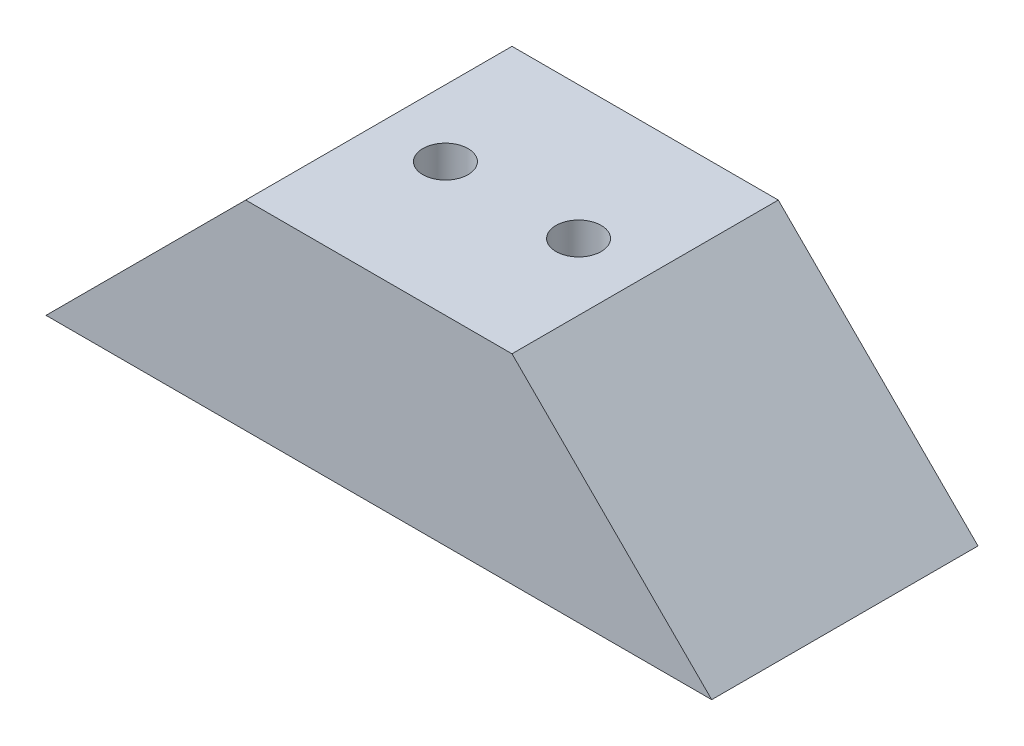
ISO-10303-21;
HEADER;
FILE_DESCRIPTION(('STEP AP214'),'2;1');
FILE_NAME('part.step','',(''),(''),'','','');
FILE_SCHEMA(('AUTOMOTIVE_DESIGN { 1 0 10303 214 1 1 1 1 }'));
ENDSEC;
DATA;
#1=APPLICATION_CONTEXT('core data for automotive mechanical design processes');
#2=APPLICATION_PROTOCOL_DEFINITION('international standard','automotive_design',2000,#1);
#3=PRODUCT_CONTEXT('',#1,'mechanical');
#4=PRODUCT('Part','Part','',(#3));
#5=PRODUCT_RELATED_PRODUCT_CATEGORY('part','',(#4));
#6=PRODUCT_DEFINITION_FORMATION('','',#4);
#7=PRODUCT_DEFINITION_CONTEXT('part definition',#1,'design');
#8=PRODUCT_DEFINITION('design','',#6,#7);
#9=PRODUCT_DEFINITION_SHAPE('','',#8);
#10=(LENGTH_UNIT() NAMED_UNIT(*) SI_UNIT(.MILLI.,.METRE.));
#11=(NAMED_UNIT(*) PLANE_ANGLE_UNIT() SI_UNIT($,.RADIAN.));
#12=(NAMED_UNIT(*) SI_UNIT($,.STERADIAN.) SOLID_ANGLE_UNIT());
#13=UNCERTAINTY_MEASURE_WITH_UNIT(LENGTH_MEASURE(1.E-05),#10,'distance_accuracy_value','');
#14=(GEOMETRIC_REPRESENTATION_CONTEXT(3) GLOBAL_UNCERTAINTY_ASSIGNED_CONTEXT((#13)) GLOBAL_UNIT_ASSIGNED_CONTEXT((#10,
#11,#12)) REPRESENTATION_CONTEXT('',''));
#15=CARTESIAN_POINT('',(0.,0.,0.));
#16=DIRECTION('',(0.,0.,1.));
#17=DIRECTION('',(1.,0.,0.));
#18=AXIS2_PLACEMENT_3D('',#15,#16,#17);
#19=CARTESIAN_POINT('',(-10.,7.50000000000001,20.));
#20=DIRECTION('',(0.,-1.,0.));
#21=DIRECTION('',(0.,0.,-1.));
#22=AXIS2_PLACEMENT_3D('',#19,#20,#21);
#23=PLANE('',#22);
#24=CARTESIAN_POINT('',(-5.,7.50000000000001,10.));
#25=DIRECTION('',(0.,1.,0.));
#26=DIRECTION('',(0.,0.,1.));
#27=AXIS2_PLACEMENT_3D('',#24,#25,#26);
#28=CIRCLE('',#27,1.7);
#29=CARTESIAN_POINT('',(-5.,7.50000000000001,11.7));
#30=VERTEX_POINT('',#29);
#31=EDGE_CURVE('E124',#30,#30,#28,.T.);
#32=ORIENTED_EDGE('',*,*,#31,.F.);
#33=EDGE_LOOP('',(#32));
#34=FACE_BOUND('',#33,.T.);
#35=CARTESIAN_POINT('',(5.,7.50000000000001,10.));
#36=DIRECTION('',(0.,1.,0.));
#37=DIRECTION('',(0.,0.,-1.));
#38=AXIS2_PLACEMENT_3D('',#35,#36,#37);
#39=CIRCLE('',#38,1.7);
#40=CARTESIAN_POINT('',(5.,7.50000000000001,8.3));
#41=VERTEX_POINT('',#40);
#42=EDGE_CURVE('E118',#41,#41,#39,.T.);
#43=ORIENTED_EDGE('',*,*,#42,.F.);
#44=EDGE_LOOP('',(#43));
#45=FACE_BOUND('',#44,.T.);
#46=DIRECTION('',(-1.,0.,0.));
#47=VECTOR('',#46,1.);
#48=CARTESIAN_POINT('',(-10.,7.50000000000001,0.));
#49=LINE('',#48,#47);
#50=CARTESIAN_POINT('',(10.,7.50000000000001,0.));
#51=VERTEX_POINT('',#50);
#52=CARTESIAN_POINT('',(-10.,7.50000000000001,0.));
#53=VERTEX_POINT('',#52);
#54=EDGE_CURVE('E104',#51,#53,#49,.T.);
#55=ORIENTED_EDGE('',*,*,#54,.T.);
#56=DIRECTION('',(0.,0.,-1.));
#57=VECTOR('',#56,1.);
#58=CARTESIAN_POINT('',(-10.,7.50000000000001,20.));
#59=LINE('',#58,#57);
#60=CARTESIAN_POINT('',(-10.,7.50000000000001,20.));
#61=VERTEX_POINT('',#60);
#62=EDGE_CURVE('E11',#61,#53,#59,.T.);
#63=ORIENTED_EDGE('',*,*,#62,.F.);
#64=DIRECTION('',(-1.,0.,0.));
#65=VECTOR('',#64,1.);
#66=CARTESIAN_POINT('',(-10.,7.50000000000001,20.));
#67=LINE('',#66,#65);
#68=CARTESIAN_POINT('',(10.,7.50000000000001,20.));
#69=VERTEX_POINT('',#68);
#70=EDGE_CURVE('E91',#69,#61,#67,.T.);
#71=ORIENTED_EDGE('',*,*,#70,.F.);
#72=DIRECTION('',(0.,0.,-1.));
#73=VECTOR('',#72,1.);
#74=CARTESIAN_POINT('',(10.,7.50000000000001,20.));
#75=LINE('',#74,#73);
#76=EDGE_CURVE('E100',#69,#51,#75,.T.);
#77=ORIENTED_EDGE('',*,*,#76,.T.);
#78=EDGE_LOOP('',(#55,#63,#71,#77));
#79=FACE_BOUND('',#78,.T.);
#80=ADVANCED_FACE('F41',(#34,#45,#79),#23,.F.);
#81=CARTESIAN_POINT('',(-10.,7.50000000000001,20.));
#82=DIRECTION('',(0.707106781186544,-0.707106781186551,0.));
#83=DIRECTION('',(0.707106781186551,0.707106781186544,0.));
#84=AXIS2_PLACEMENT_3D('',#81,#82,#83);
#85=PLANE('',#84);
#86=DIRECTION('',(-0.707106781186551,-0.707106781186544,0.));
#87=VECTOR('',#86,1.);
#88=CARTESIAN_POINT('',(-10.,7.50000000000001,0.));
#89=LINE('',#88,#87);
#90=CARTESIAN_POINT('',(-25.0000000000002,-7.49999999999999,0.));
#91=VERTEX_POINT('',#90);
#92=EDGE_CURVE('E96',#53,#91,#89,.T.);
#93=ORIENTED_EDGE('',*,*,#92,.T.);
#94=DIRECTION('',(0.,0.,-1.));
#95=VECTOR('',#94,1.);
#96=CARTESIAN_POINT('',(-25.0000000000002,-7.49999999999999,20.));
#97=LINE('',#96,#95);
#98=CARTESIAN_POINT('',(-25.0000000000002,-7.49999999999999,20.));
#99=VERTEX_POINT('',#98);
#100=EDGE_CURVE('E49',#99,#91,#97,.T.);
#101=ORIENTED_EDGE('',*,*,#100,.F.);
#102=DIRECTION('',(-0.707106781186551,-0.707106781186544,0.));
#103=VECTOR('',#102,1.);
#104=CARTESIAN_POINT('',(-10.,7.50000000000001,20.));
#105=LINE('',#104,#103);
#106=EDGE_CURVE('E86',#61,#99,#105,.T.);
#107=ORIENTED_EDGE('',*,*,#106,.F.);
#108=ORIENTED_EDGE('',*,*,#62,.T.);
#109=EDGE_LOOP('',(#93,#101,#107,#108));
#110=FACE_BOUND('',#109,.T.);
#111=ADVANCED_FACE('F95',(#110),#85,.F.);
#112=CARTESIAN_POINT('',(25.0000000000002,-7.49999999999999,20.));
#113=DIRECTION('',(0.,1.,0.));
#114=DIRECTION('',(-1.,0.,0.));
#115=AXIS2_PLACEMENT_3D('',#112,#113,#114);
#116=PLANE('',#115);
#117=CARTESIAN_POINT('',(-5.,-7.5,10.));
#118=DIRECTION('',(0.,1.,0.));
#119=DIRECTION('',(0.,0.,1.));
#120=AXIS2_PLACEMENT_3D('',#117,#118,#119);
#121=CIRCLE('',#120,1.7);
#122=CARTESIAN_POINT('',(-5.,-7.5,11.7));
#123=VERTEX_POINT('',#122);
#124=EDGE_CURVE('E107',#123,#123,#121,.T.);
#125=ORIENTED_EDGE('',*,*,#124,.T.);
#126=EDGE_LOOP('',(#125));
#127=FACE_BOUND('',#126,.T.);
#128=CARTESIAN_POINT('',(5.,-7.5,10.));
#129=DIRECTION('',(0.,1.,0.));
#130=DIRECTION('',(0.,0.,-1.));
#131=AXIS2_PLACEMENT_3D('',#128,#129,#130);
#132=CIRCLE('',#131,1.7);
#133=CARTESIAN_POINT('',(5.,-7.5,8.3));
#134=VERTEX_POINT('',#133);
#135=EDGE_CURVE('E121',#134,#134,#132,.T.);
#136=ORIENTED_EDGE('',*,*,#135,.T.);
#137=EDGE_LOOP('',(#136));
#138=FACE_BOUND('',#137,.T.);
#139=DIRECTION('',(1.,0.,0.));
#140=VECTOR('',#139,1.);
#141=CARTESIAN_POINT('',(25.0000000000002,-7.49999999999999,0.));
#142=LINE('',#141,#140);
#143=CARTESIAN_POINT('',(25.0000000000002,-7.49999999999999,0.));
#144=VERTEX_POINT('',#143);
#145=EDGE_CURVE('E73',#91,#144,#142,.T.);
#146=ORIENTED_EDGE('',*,*,#145,.T.);
#147=DIRECTION('',(0.,0.,-1.));
#148=VECTOR('',#147,1.);
#149=CARTESIAN_POINT('',(25.0000000000002,-7.49999999999999,20.));
#150=LINE('',#149,#148);
#151=CARTESIAN_POINT('',(25.0000000000002,-7.49999999999999,20.));
#152=VERTEX_POINT('',#151);
#153=EDGE_CURVE('E97',#152,#144,#150,.T.);
#154=ORIENTED_EDGE('',*,*,#153,.F.);
#155=DIRECTION('',(1.,0.,0.));
#156=VECTOR('',#155,1.);
#157=CARTESIAN_POINT('',(-25.0000000000002,-7.49999999999999,20.));
#158=LINE('',#157,#156);
#159=EDGE_CURVE('E89',#99,#152,#158,.T.);
#160=ORIENTED_EDGE('',*,*,#159,.F.);
#161=ORIENTED_EDGE('',*,*,#100,.T.);
#162=EDGE_LOOP('',(#146,#154,#160,#161));
#163=FACE_BOUND('',#162,.T.);
#164=ADVANCED_FACE('F98',(#127,#138,#163),#116,.F.);
#165=CARTESIAN_POINT('',(10.,7.50000000000001,20.));
#166=DIRECTION('',(-0.707106781186543,-0.707106781186552,0.));
#167=DIRECTION('',(0.707106781186552,-0.707106781186543,0.));
#168=AXIS2_PLACEMENT_3D('',#165,#166,#167);
#169=PLANE('',#168);
#170=DIRECTION('',(-0.707106781186552,0.707106781186543,0.));
#171=VECTOR('',#170,1.);
#172=CARTESIAN_POINT('',(10.,7.50000000000001,0.));
#173=LINE('',#172,#171);
#174=EDGE_CURVE('E79',#144,#51,#173,.T.);
#175=ORIENTED_EDGE('',*,*,#174,.T.);
#176=ORIENTED_EDGE('',*,*,#76,.F.);
#177=DIRECTION('',(-0.707106781186552,0.707106781186543,0.));
#178=VECTOR('',#177,1.);
#179=CARTESIAN_POINT('',(10.,7.50000000000001,20.));
#180=LINE('',#179,#178);
#181=EDGE_CURVE('E57',#152,#69,#180,.T.);
#182=ORIENTED_EDGE('',*,*,#181,.F.);
#183=ORIENTED_EDGE('',*,*,#153,.T.);
#184=EDGE_LOOP('',(#175,#176,#182,#183));
#185=FACE_BOUND('',#184,.T.);
#186=ADVANCED_FACE('F112',(#185),#169,.F.);
#187=CARTESIAN_POINT('',(0.,0.,20.));
#188=DIRECTION('',(0.,0.,-1.));
#189=DIRECTION('',(-1.,0.,0.));
#190=AXIS2_PLACEMENT_3D('',#187,#188,#189);
#191=PLANE('',#190);
#192=ORIENTED_EDGE('',*,*,#70,.T.);
#193=ORIENTED_EDGE('',*,*,#106,.T.);
#194=ORIENTED_EDGE('',*,*,#159,.T.);
#195=ORIENTED_EDGE('',*,*,#181,.T.);
#196=EDGE_LOOP('',(#192,#193,#194,#195));
#197=FACE_BOUND('',#196,.T.);
#198=ADVANCED_FACE('F87',(#197),#191,.F.);
#199=CARTESIAN_POINT('',(0.,0.,0.));
#200=DIRECTION('',(0.,0.,-1.));
#201=DIRECTION('',(-1.,0.,0.));
#202=AXIS2_PLACEMENT_3D('',#199,#200,#201);
#203=PLANE('',#202);
#204=ORIENTED_EDGE('',*,*,#54,.F.);
#205=ORIENTED_EDGE('',*,*,#174,.F.);
#206=ORIENTED_EDGE('',*,*,#145,.F.);
#207=ORIENTED_EDGE('',*,*,#92,.F.);
#208=EDGE_LOOP('',(#204,#205,#206,#207));
#209=FACE_BOUND('',#208,.T.);
#210=ADVANCED_FACE('F115',(#209),#203,.T.);
#211=CARTESIAN_POINT('',(5.,-7.5,10.));
#212=DIRECTION('',(0.,1.,0.));
#213=DIRECTION('',(0.,0.,1.));
#214=AXIS2_PLACEMENT_3D('',#211,#212,#213);
#215=CYLINDRICAL_SURFACE('',#214,1.7);
#216=ORIENTED_EDGE('',*,*,#135,.F.);
#217=EDGE_LOOP('',(#216));
#218=FACE_BOUND('',#217,.T.);
#219=ORIENTED_EDGE('',*,*,#42,.T.);
#220=EDGE_LOOP('',(#219));
#221=FACE_BOUND('',#220,.T.);
#222=ADVANCED_FACE('F135',(#218,#221),#215,.F.);
#223=CARTESIAN_POINT('',(-5.,-7.5,10.));
#224=DIRECTION('',(0.,1.,0.));
#225=DIRECTION('',(0.,0.,1.));
#226=AXIS2_PLACEMENT_3D('',#223,#224,#225);
#227=CYLINDRICAL_SURFACE('',#226,1.7);
#228=ORIENTED_EDGE('',*,*,#124,.F.);
#229=EDGE_LOOP('',(#228));
#230=FACE_BOUND('',#229,.T.);
#231=ORIENTED_EDGE('',*,*,#31,.T.);
#232=EDGE_LOOP('',(#231));
#233=FACE_BOUND('',#232,.T.);
#234=ADVANCED_FACE('F132',(#230,#233),#227,.F.);
#235=CLOSED_SHELL('',(#80,#111,#164,#186,#198,#210,#222,#234));
#236=MANIFOLD_SOLID_BREP('B2',#235);
#237=ADVANCED_BREP_SHAPE_REPRESENTATION('',(#18,#236),#14);
#238=SHAPE_DEFINITION_REPRESENTATION(#9,#237);
ENDSEC;
END-ISO-10303-21;
